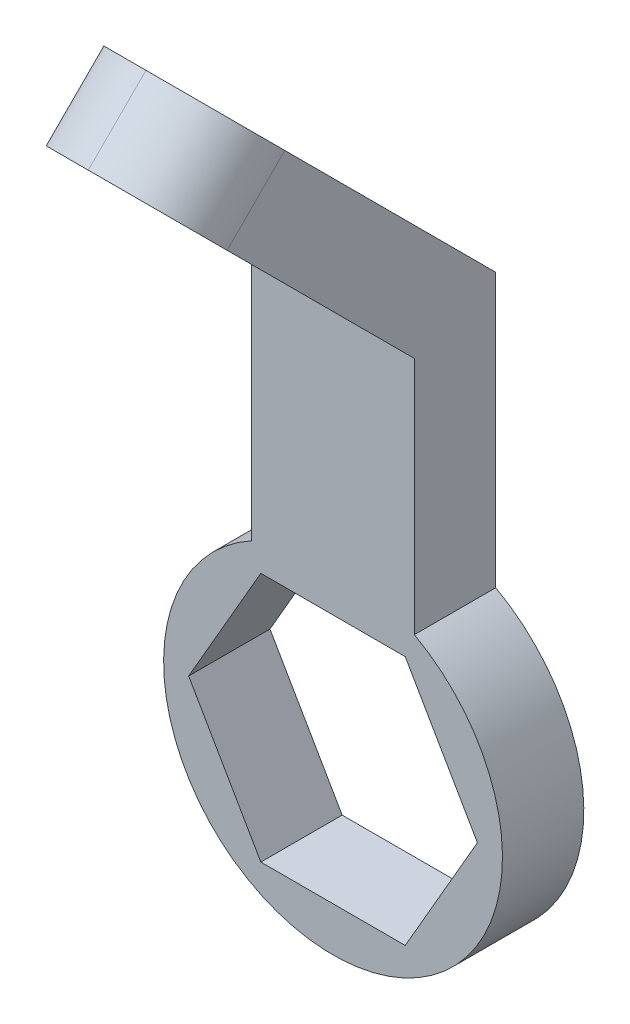
ISO-10303-21;
HEADER;
FILE_DESCRIPTION(('STEP AP214'),'2;1');
FILE_NAME('part.step','',(''),(''),'','','');
FILE_SCHEMA(('AUTOMOTIVE_DESIGN { 1 0 10303 214 1 1 1 1 }'));
ENDSEC;
DATA;
#1=APPLICATION_CONTEXT('core data for automotive mechanical design processes');
#2=APPLICATION_PROTOCOL_DEFINITION('international standard','automotive_design',2000,#1);
#3=PRODUCT_CONTEXT('',#1,'mechanical');
#4=PRODUCT('Part','Part','',(#3));
#5=PRODUCT_RELATED_PRODUCT_CATEGORY('part','',(#4));
#6=PRODUCT_DEFINITION_FORMATION('','',#4);
#7=PRODUCT_DEFINITION_CONTEXT('part definition',#1,'design');
#8=PRODUCT_DEFINITION('design','',#6,#7);
#9=PRODUCT_DEFINITION_SHAPE('','',#8);
#10=(LENGTH_UNIT() NAMED_UNIT(*) SI_UNIT(.MILLI.,.METRE.));
#11=(NAMED_UNIT(*) PLANE_ANGLE_UNIT() SI_UNIT($,.RADIAN.));
#12=(NAMED_UNIT(*) SI_UNIT($,.STERADIAN.) SOLID_ANGLE_UNIT());
#13=UNCERTAINTY_MEASURE_WITH_UNIT(LENGTH_MEASURE(1.E-05),#10,'distance_accuracy_value','');
#14=(GEOMETRIC_REPRESENTATION_CONTEXT(3) GLOBAL_UNCERTAINTY_ASSIGNED_CONTEXT((#13)) GLOBAL_UNIT_ASSIGNED_CONTEXT((#10,
#11,#12)) REPRESENTATION_CONTEXT('',''));
#15=CARTESIAN_POINT('',(0.,0.,0.));
#16=DIRECTION('',(0.,0.,1.));
#17=DIRECTION('',(1.,0.,0.));
#18=AXIS2_PLACEMENT_3D('',#15,#16,#17);
#19=CARTESIAN_POINT('',(0.,0.958861684190168,89.7649069469521));
#20=DIRECTION('',(0.,0.707106781186548,-0.707106781186547));
#21=DIRECTION('',(0.,0.707106781186547,0.707106781186548));
#22=AXIS2_PLACEMENT_3D('',#19,#20,#21);
#23=CYLINDRICAL_SURFACE('',#22,4.);
#24=CARTESIAN_POINT('',(0.,60.1282406104083,30.595528020734));
#25=DIRECTION('',(0.,-0.707106781186548,0.707106781186547));
#26=DIRECTION('',(0.,-0.707106781186547,-0.707106781186548));
#27=AXIS2_PLACEMENT_3D('',#24,#25,#26);
#28=CIRCLE('',#27,4.);
#29=CARTESIAN_POINT('',(0.,57.2998134856621,27.7671008959878));
#30=VERTEX_POINT('',#29);
#31=EDGE_CURVE('E174',#30,#30,#28,.T.);
#32=ORIENTED_EDGE('',*,*,#31,.T.);
#33=EDGE_LOOP('',(#32));
#34=FACE_BOUND('',#33,.T.);
#35=CARTESIAN_POINT('',(0.,64.9958772070163,25.727891424126));
#36=DIRECTION('',(0.,0.707106781186548,-0.707106781186547));
#37=DIRECTION('',(0.,0.707106781186547,0.707106781186548));
#38=AXIS2_PLACEMENT_3D('',#35,#36,#37);
#39=CIRCLE('',#38,4.);
#40=CARTESIAN_POINT('',(0.,67.8243043317625,28.5563185488722));
#41=VERTEX_POINT('',#40);
#42=EDGE_CURVE('E270',#41,#41,#39,.T.);
#43=ORIENTED_EDGE('',*,*,#42,.T.);
#44=EDGE_LOOP('',(#43));
#45=FACE_BOUND('',#44,.T.);
#46=ADVANCED_FACE('F43',(#34,#45),#23,.F.);
#47=CARTESIAN_POINT('',(0.,-21.8968107831433,-6.2));
#48=DIRECTION('',(0.,0.,1.));
#49=DIRECTION('',(1.,0.,0.));
#50=AXIS2_PLACEMENT_3D('',#47,#48,#49);
#51=CYLINDRICAL_SURFACE('',#50,24.9999979598998);
#52=DIRECTION('',(0.,0.,1.));
#53=VECTOR('',#52,1.);
#54=CARTESIAN_POINT('',(12.0000001284265,0.0348990205350161,-6.2));
#55=LINE('',#54,#53);
#56=CARTESIAN_POINT('',(12.0000001284265,0.0348990205350161,-6.2));
#57=VERTEX_POINT('',#56);
#58=CARTESIAN_POINT('',(12.0000001284265,0.0348990205350161,5.8));
#59=VERTEX_POINT('',#58);
#60=EDGE_CURVE('E230',#57,#59,#55,.T.);
#61=ORIENTED_EDGE('',*,*,#60,.T.);
#62=CARTESIAN_POINT('',(0.,-21.8968107831433,5.8));
#63=DIRECTION('',(0.,0.,1.));
#64=DIRECTION('',(1.,0.,0.));
#65=AXIS2_PLACEMENT_3D('',#62,#63,#64);
#66=CIRCLE('',#65,24.9999979598998);
#67=CARTESIAN_POINT('',(-12.0000000801898,0.0348990205350161,5.8));
#68=VERTEX_POINT('',#67);
#69=EDGE_CURVE('E200',#68,#59,#66,.T.);
#70=ORIENTED_EDGE('',*,*,#69,.F.);
#71=DIRECTION('',(0.,0.,1.));
#72=VECTOR('',#71,1.);
#73=CARTESIAN_POINT('',(-12.0000000801898,0.0348990205350161,-6.2));
#74=LINE('',#73,#72);
#75=CARTESIAN_POINT('',(-12.0000000801898,0.0348990205350161,-6.2));
#76=VERTEX_POINT('',#75);
#77=EDGE_CURVE('E227',#76,#68,#74,.T.);
#78=ORIENTED_EDGE('',*,*,#77,.F.);
#79=CARTESIAN_POINT('',(0.,-21.8968107831433,-6.2));
#80=DIRECTION('',(0.,0.,1.));
#81=DIRECTION('',(1.,0.,0.));
#82=AXIS2_PLACEMENT_3D('',#79,#80,#81);
#83=CIRCLE('',#82,24.9999979598998);
#84=EDGE_CURVE('E149',#76,#57,#83,.T.);
#85=ORIENTED_EDGE('',*,*,#84,.T.);
#86=EDGE_LOOP('',(#61,#70,#78,#85));
#87=FACE_BOUND('',#86,.T.);
#88=ADVANCED_FACE('F286',(#87),#51,.T.);
#89=CARTESIAN_POINT('',(-12.0000000801898,0.,-6.2));
#90=DIRECTION('',(1.,0.,0.));
#91=DIRECTION('',(0.,0.,-1.));
#92=AXIS2_PLACEMENT_3D('',#89,#90,#91);
#93=PLANE('',#92);
#94=DIRECTION('',(0.,-0.707106781186547,-0.707106781186548));
#95=VECTOR('',#94,1.);
#96=CARTESIAN_POINT('',(-11.9999998715735,71.441949109393,41.9092365197188));
#97=LINE('',#96,#95);
#98=CARTESIAN_POINT('',(-11.9999998715735,62.9566677351544,33.4239551454802));
#99=VERTEX_POINT('',#98);
#100=CARTESIAN_POINT('',(-11.9999998715735,35.3511856291118,5.81847303943753));
#101=VERTEX_POINT('',#100);
#102=EDGE_CURVE('E166',#99,#101,#97,.T.);
#103=ORIENTED_EDGE('',*,*,#102,.F.);
#104=DIRECTION('',(0.,-0.707106781186548,0.707106781186547));
#105=VECTOR('',#104,1.);
#106=CARTESIAN_POINT('',(-12.0000000801898,71.4659042548732,24.9147186257614));
#107=LINE('',#106,#105);
#108=CARTESIAN_POINT('',(-11.9999998715735,71.4659042548732,24.9147186257614));
#109=VERTEX_POINT('',#108);
#110=EDGE_CURVE('E165',#99,#109,#107,.F.);
#111=ORIENTED_EDGE('',*,*,#110,.T.);
#112=DIRECTION('',(0.,0.707106781186547,0.707106781186548));
#113=VECTOR('',#112,1.);
#114=CARTESIAN_POINT('',(-11.9999998715735,40.3511856291118,-6.2));
#115=LINE('',#114,#113);
#116=CARTESIAN_POINT('',(-11.9999998715735,40.3511856291118,-6.2));
#117=VERTEX_POINT('',#116);
#118=EDGE_CURVE('E156',#117,#109,#115,.T.);
#119=ORIENTED_EDGE('',*,*,#118,.F.);
#120=DIRECTION('',(0.,1.,0.));
#121=VECTOR('',#120,1.);
#122=CARTESIAN_POINT('',(-12.0000000801898,0.,-6.2));
#123=LINE('',#122,#121);
#124=EDGE_CURVE('E143',#76,#117,#123,.T.);
#125=ORIENTED_EDGE('',*,*,#124,.F.);
#126=ORIENTED_EDGE('',*,*,#77,.T.);
#127=DIRECTION('',(0.,1.,0.));
#128=VECTOR('',#127,1.);
#129=CARTESIAN_POINT('',(-12.0000000801898,0.,5.8));
#130=LINE('',#129,#128);
#131=CARTESIAN_POINT('',(-12.0000000801898,35.3511856291118,5.8));
#132=VERTEX_POINT('',#131);
#133=EDGE_CURVE('E209',#68,#132,#130,.T.);
#134=ORIENTED_EDGE('',*,*,#133,.T.);
#135=DIRECTION('',(0.,0.,-1.));
#136=VECTOR('',#135,1.);
#137=CARTESIAN_POINT('',(-11.9999998715735,35.3511856291118,5.81847303943753));
#138=LINE('',#137,#136);
#139=EDGE_CURVE('E159',#101,#132,#138,.T.);
#140=ORIENTED_EDGE('',*,*,#139,.F.);
#141=EDGE_LOOP('',(#103,#111,#119,#125,#126,#134,#140));
#142=FACE_BOUND('',#141,.T.);
#143=ADVANCED_FACE('F163',(#142),#93,.F.);
#144=CARTESIAN_POINT('',(-2.59716233791978E-06,-40.3468107831432,-6.2));
#145=DIRECTION('',(-6.43709450018008E-08,-0.999999999999998,0.));
#146=DIRECTION('',(0.999999999999998,-6.43709450018008E-08,0.));
#147=AXIS2_PLACEMENT_3D('',#144,#145,#146);
#148=PLANE('',#147);
#149=DIRECTION('',(0.,0.,1.));
#150=VECTOR('',#149,1.);
#151=CARTESIAN_POINT('',(-10.6521136541925,-40.3468100974567,-6.2));
#152=LINE('',#151,#150);
#153=CARTESIAN_POINT('',(-10.6521136541925,-40.3468100974567,-6.2));
#154=VERTEX_POINT('',#153);
#155=CARTESIAN_POINT('',(-10.6521136541925,-40.3468100974567,5.8));
#156=VERTEX_POINT('',#155);
#157=EDGE_CURVE('E152',#154,#156,#152,.T.);
#158=ORIENTED_EDGE('',*,*,#157,.T.);
#159=DIRECTION('',(0.999999999999998,-6.43709450018008E-08,0.));
#160=VECTOR('',#159,1.);
#161=CARTESIAN_POINT('',(-2.59716233791978E-06,-40.3468107831432,5.8));
#162=LINE('',#161,#160);
#163=CARTESIAN_POINT('',(10.6521112789046,-40.3468114688298,5.8));
#164=VERTEX_POINT('',#163);
#165=EDGE_CURVE('E181',#156,#164,#162,.T.);
#166=ORIENTED_EDGE('',*,*,#165,.T.);
#167=DIRECTION('',(0.,0.,1.));
#168=VECTOR('',#167,1.);
#169=CARTESIAN_POINT('',(10.6521112789046,-40.3468114688298,-6.2));
#170=LINE('',#169,#168);
#171=CARTESIAN_POINT('',(10.6521112789046,-40.3468114688298,-6.2));
#172=VERTEX_POINT('',#171);
#173=EDGE_CURVE('E232',#172,#164,#170,.T.);
#174=ORIENTED_EDGE('',*,*,#173,.F.);
#175=DIRECTION('',(0.999999999999998,-6.43709450018008E-08,0.));
#176=VECTOR('',#175,1.);
#177=CARTESIAN_POINT('',(-2.59716233791978E-06,-40.3468107831432,-6.2));
#178=LINE('',#177,#176);
#179=EDGE_CURVE('E212',#154,#172,#178,.T.);
#180=ORIENTED_EDGE('',*,*,#179,.F.);
#181=EDGE_LOOP('',(#158,#166,#174,#180));
#182=FACE_BOUND('',#181,.T.);
#183=ADVANCED_FACE('F315',(#182),#148,.F.);
#184=CARTESIAN_POINT('',(25.4597660107916,-14.6992049449944,-6.2));
#185=DIRECTION('',(0.866025371598965,-0.500000055746872,0.));
#186=DIRECTION('',(0.500000055746872,0.866025371598965,0.));
#187=AXIS2_PLACEMENT_3D('',#184,#185,#186);
#188=PLANE('',#187);
#189=ORIENTED_EDGE('',*,*,#173,.T.);
#190=DIRECTION('',(0.500000055746872,0.866025371598965,0.));
#191=VECTOR('',#190,1.);
#192=CARTESIAN_POINT('',(25.4597660107916,-14.6992049449944,5.8));
#193=LINE('',#192,#191);
#194=CARTESIAN_POINT('',(21.3042249330971,-21.8968121545164,5.8));
#195=VERTEX_POINT('',#194);
#196=EDGE_CURVE('E197',#164,#195,#193,.T.);
#197=ORIENTED_EDGE('',*,*,#196,.T.);
#198=DIRECTION('',(0.,0.,1.));
#199=VECTOR('',#198,1.);
#200=CARTESIAN_POINT('',(21.3042249330971,-21.8968121545164,-6.2));
#201=LINE('',#200,#199);
#202=CARTESIAN_POINT('',(21.3042249330971,-21.8968121545164,-6.2));
#203=VERTEX_POINT('',#202);
#204=EDGE_CURVE('E234',#203,#195,#201,.T.);
#205=ORIENTED_EDGE('',*,*,#204,.F.);
#206=DIRECTION('',(0.500000055746872,0.866025371598965,0.));
#207=VECTOR('',#206,1.);
#208=CARTESIAN_POINT('',(25.4597660107916,-14.6992049449944,-6.2));
#209=LINE('',#208,#207);
#210=EDGE_CURVE('E223',#172,#203,#209,.T.);
#211=ORIENTED_EDGE('',*,*,#210,.F.);
#212=EDGE_LOOP('',(#189,#197,#205,#211));
#213=FACE_BOUND('',#212,.T.);
#214=ADVANCED_FACE('F320',(#213),#188,.F.);
#215=CARTESIAN_POINT('',(6.49657279837254,3.75079749636303,-6.2));
#216=DIRECTION('',(0.866025435969909,0.499999944253125,0.));
#217=DIRECTION('',(-0.499999944253125,0.866025435969909,0.));
#218=AXIS2_PLACEMENT_3D('',#215,#216,#217);
#219=PLANE('',#218);
#220=ORIENTED_EDGE('',*,*,#204,.T.);
#221=DIRECTION('',(-0.499999944253125,0.866025435969909,0.));
#222=VECTOR('',#221,1.);
#223=CARTESIAN_POINT('',(6.49657279837254,3.75079749636303,5.8));
#224=LINE('',#223,#222);
#225=CARTESIAN_POINT('',(10.6521136541925,-3.44681146882988,5.8));
#226=VERTEX_POINT('',#225);
#227=EDGE_CURVE('E194',#195,#226,#224,.T.);
#228=ORIENTED_EDGE('',*,*,#227,.T.);
#229=DIRECTION('',(0.,0.,1.));
#230=VECTOR('',#229,1.);
#231=CARTESIAN_POINT('',(10.6521136541925,-3.44681146882988,-6.2));
#232=LINE('',#231,#230);
#233=CARTESIAN_POINT('',(10.6521136541925,-3.44681146882988,-6.2));
#234=VERTEX_POINT('',#233);
#235=EDGE_CURVE('E236',#234,#226,#232,.T.);
#236=ORIENTED_EDGE('',*,*,#235,.F.);
#237=DIRECTION('',(-0.499999944253125,0.866025435969909,0.));
#238=VECTOR('',#237,1.);
#239=CARTESIAN_POINT('',(6.49657279837254,3.75079749636303,-6.2));
#240=LINE('',#239,#238);
#241=EDGE_CURVE('E221',#203,#234,#240,.T.);
#242=ORIENTED_EDGE('',*,*,#241,.F.);
#243=EDGE_LOOP('',(#220,#228,#236,#242));
#244=FACE_BOUND('',#243,.T.);
#245=ADVANCED_FACE('F323',(#244),#219,.F.);
#246=CARTESIAN_POINT('',(-2.21874467212998E-07,-3.44681078314324,-6.2));
#247=DIRECTION('',(6.43709449610877E-08,0.999999999999998,0.));
#248=DIRECTION('',(-0.999999999999998,6.43709449610877E-08,0.));
#249=AXIS2_PLACEMENT_3D('',#246,#247,#248);
#250=PLANE('',#249);
#251=ORIENTED_EDGE('',*,*,#235,.T.);
#252=DIRECTION('',(-0.999999999999998,6.43709449610877E-08,0.));
#253=VECTOR('',#252,1.);
#254=CARTESIAN_POINT('',(-2.21874467212998E-07,-3.44681078314324,5.8));
#255=LINE('',#254,#253);
#256=CARTESIAN_POINT('',(-10.6521112789046,-3.44681009745679,5.8));
#257=VERTEX_POINT('',#256);
#258=EDGE_CURVE('E191',#226,#257,#255,.T.);
#259=ORIENTED_EDGE('',*,*,#258,.T.);
#260=DIRECTION('',(0.,0.,1.));
#261=VECTOR('',#260,1.);
#262=CARTESIAN_POINT('',(-10.6521112789046,-3.44681009745679,-6.2));
#263=LINE('',#262,#261);
#264=CARTESIAN_POINT('',(-10.6521112789046,-3.44681009745679,-6.2));
#265=VERTEX_POINT('',#264);
#266=EDGE_CURVE('E238',#265,#257,#263,.T.);
#267=ORIENTED_EDGE('',*,*,#266,.F.);
#268=DIRECTION('',(-0.999999999999998,6.43709449610877E-08,0.));
#269=VECTOR('',#268,1.);
#270=CARTESIAN_POINT('',(-2.21874467212998E-07,-3.44681078314324,-6.2));
#271=LINE('',#270,#269);
#272=EDGE_CURVE('E219',#234,#265,#271,.T.);
#273=ORIENTED_EDGE('',*,*,#272,.F.);
#274=EDGE_LOOP('',(#251,#259,#267,#273));
#275=FACE_BOUND('',#274,.T.);
#276=ADVANCED_FACE('F327',(#275),#250,.F.);
#277=CARTESIAN_POINT('',(-6.49657020121022,3.75079711206519,-6.2));
#278=DIRECTION('',(-0.866025371598965,0.500000055746872,0.));
#279=DIRECTION('',(-0.500000055746872,-0.866025371598965,0.));
#280=AXIS2_PLACEMENT_3D('',#277,#278,#279);
#281=PLANE('',#280);
#282=ORIENTED_EDGE('',*,*,#266,.T.);
#283=DIRECTION('',(-0.500000055746872,-0.866025371598965,0.));
#284=VECTOR('',#283,1.);
#285=CARTESIAN_POINT('',(-6.49657020121022,3.75079711206519,5.8));
#286=LINE('',#285,#284);
#287=CARTESIAN_POINT('',(-21.3042249330971,-21.8968094117702,5.8));
#288=VERTEX_POINT('',#287);
#289=EDGE_CURVE('E188',#257,#288,#286,.T.);
#290=ORIENTED_EDGE('',*,*,#289,.T.);
#291=DIRECTION('',(0.,0.,1.));
#292=VECTOR('',#291,1.);
#293=CARTESIAN_POINT('',(-21.3042249330971,-21.8968094117702,-6.2));
#294=LINE('',#293,#292);
#295=CARTESIAN_POINT('',(-21.3042249330971,-21.8968094117702,-6.2));
#296=VERTEX_POINT('',#295);
#297=EDGE_CURVE('E240',#296,#288,#294,.T.);
#298=ORIENTED_EDGE('',*,*,#297,.F.);
#299=DIRECTION('',(-0.500000055746872,-0.866025371598965,0.));
#300=VECTOR('',#299,1.);
#301=CARTESIAN_POINT('',(-6.49657020121022,3.75079711206519,-6.2));
#302=LINE('',#301,#300);
#303=EDGE_CURVE('E217',#265,#296,#302,.T.);
#304=ORIENTED_EDGE('',*,*,#303,.F.);
#305=EDGE_LOOP('',(#282,#290,#298,#304));
#306=FACE_BOUND('',#305,.T.);
#307=ADVANCED_FACE('F331',(#306),#281,.F.);
#308=CARTESIAN_POINT('',(-25.4597657889171,-14.6992004465773,-6.2));
#309=DIRECTION('',(-0.866025435969909,-0.499999944253125,0.));
#310=DIRECTION('',(0.499999944253125,-0.86602543596991,0.));
#311=AXIS2_PLACEMENT_3D('',#308,#309,#310);
#312=PLANE('',#311);
#313=ORIENTED_EDGE('',*,*,#297,.T.);
#314=DIRECTION('',(0.499999944253125,-0.866025435969909,0.));
#315=VECTOR('',#314,1.);
#316=CARTESIAN_POINT('',(-25.4597657889171,-14.6992004465773,5.8));
#317=LINE('',#316,#315);
#318=EDGE_CURVE('E185',#288,#156,#317,.T.);
#319=ORIENTED_EDGE('',*,*,#318,.T.);
#320=ORIENTED_EDGE('',*,*,#157,.F.);
#321=DIRECTION('',(0.499999944253125,-0.866025435969909,0.));
#322=VECTOR('',#321,1.);
#323=CARTESIAN_POINT('',(-25.4597657889171,-14.6992004465773,-6.2));
#324=LINE('',#323,#322);
#325=EDGE_CURVE('E215',#296,#154,#324,.T.);
#326=ORIENTED_EDGE('',*,*,#325,.F.);
#327=EDGE_LOOP('',(#313,#319,#320,#326));
#328=FACE_BOUND('',#327,.T.);
#329=ADVANCED_FACE('F317',(#328),#312,.F.);
#330=CARTESIAN_POINT('',(12.0000001284265,0.,-6.2));
#331=DIRECTION('',(1.,0.,0.));
#332=DIRECTION('',(0.,0.,-1.));
#333=AXIS2_PLACEMENT_3D('',#330,#331,#332);
#334=PLANE('',#333);
#335=DIRECTION('',(0.,0.707106781186547,0.707106781186548));
#336=VECTOR('',#335,1.);
#337=CARTESIAN_POINT('',(12.0000001284265,40.3511856291118,-6.2));
#338=LINE('',#337,#336);
#339=CARTESIAN_POINT('',(12.0000001284265,40.3511856291118,-6.2));
#340=VERTEX_POINT('',#339);
#341=CARTESIAN_POINT('',(12.0000001284265,71.4659042548732,24.9147186257614));
#342=VERTEX_POINT('',#341);
#343=EDGE_CURVE('E157',#340,#342,#338,.T.);
#344=ORIENTED_EDGE('',*,*,#343,.T.);
#345=DIRECTION('',(0.,-0.707106781186548,0.707106781186547));
#346=VECTOR('',#345,1.);
#347=CARTESIAN_POINT('',(12.0000001284265,51.2903114403172,45.0903114403174));
#348=LINE('',#347,#346);
#349=CARTESIAN_POINT('',(12.0000001284265,62.9566677351544,33.4239551454802));
#350=VERTEX_POINT('',#349);
#351=EDGE_CURVE('E11',#342,#350,#348,.T.);
#352=ORIENTED_EDGE('',*,*,#351,.T.);
#353=DIRECTION('',(0.,-0.707106781186547,-0.707106781186548));
#354=VECTOR('',#353,1.);
#355=CARTESIAN_POINT('',(12.0000001284265,71.441949109393,41.9092365197188));
#356=LINE('',#355,#354);
#357=CARTESIAN_POINT('',(12.0000001284265,35.3511856291118,5.81847303943753));
#358=VERTEX_POINT('',#357);
#359=EDGE_CURVE('E171',#350,#358,#356,.T.);
#360=ORIENTED_EDGE('',*,*,#359,.T.);
#361=DIRECTION('',(0.,0.,-1.));
#362=VECTOR('',#361,1.);
#363=CARTESIAN_POINT('',(12.0000001284265,35.3511856291118,5.81847303943753));
#364=LINE('',#363,#362);
#365=CARTESIAN_POINT('',(12.0000001284265,35.3511856291118,5.8));
#366=VERTEX_POINT('',#365);
#367=EDGE_CURVE('E167',#358,#366,#364,.T.);
#368=ORIENTED_EDGE('',*,*,#367,.T.);
#369=DIRECTION('',(0.,1.,0.));
#370=VECTOR('',#369,1.);
#371=CARTESIAN_POINT('',(12.0000001284265,0.,5.8));
#372=LINE('',#371,#370);
#373=EDGE_CURVE('E203',#59,#366,#372,.T.);
#374=ORIENTED_EDGE('',*,*,#373,.F.);
#375=ORIENTED_EDGE('',*,*,#60,.F.);
#376=DIRECTION('',(0.,1.,0.));
#377=VECTOR('',#376,1.);
#378=CARTESIAN_POINT('',(12.0000001284265,0.,-6.2));
#379=LINE('',#378,#377);
#380=EDGE_CURVE('E153',#57,#340,#379,.T.);
#381=ORIENTED_EDGE('',*,*,#380,.T.);
#382=EDGE_LOOP('',(#344,#352,#360,#368,#374,#375,#381));
#383=FACE_BOUND('',#382,.T.);
#384=ADVANCED_FACE('F311',(#383),#334,.T.);
#385=CARTESIAN_POINT('',(0.,0.,-6.2));
#386=DIRECTION('',(0.,0.,1.));
#387=DIRECTION('',(1.,0.,0.));
#388=AXIS2_PLACEMENT_3D('',#385,#386,#387);
#389=PLANE('',#388);
#390=ORIENTED_EDGE('',*,*,#179,.T.);
#391=ORIENTED_EDGE('',*,*,#210,.T.);
#392=ORIENTED_EDGE('',*,*,#241,.T.);
#393=ORIENTED_EDGE('',*,*,#272,.T.);
#394=ORIENTED_EDGE('',*,*,#303,.T.);
#395=ORIENTED_EDGE('',*,*,#325,.T.);
#396=EDGE_LOOP('',(#390,#391,#392,#393,#394,#395));
#397=FACE_BOUND('',#396,.T.);
#398=ORIENTED_EDGE('',*,*,#84,.F.);
#399=ORIENTED_EDGE('',*,*,#124,.T.);
#400=DIRECTION('',(1.,0.,0.));
#401=VECTOR('',#400,1.);
#402=CARTESIAN_POINT('',(-11.9999998715735,40.3511856291118,-6.2));
#403=LINE('',#402,#401);
#404=EDGE_CURVE('E147',#117,#340,#403,.T.);
#405=ORIENTED_EDGE('',*,*,#404,.T.);
#406=ORIENTED_EDGE('',*,*,#380,.F.);
#407=EDGE_LOOP('',(#398,#399,#405,#406));
#408=FACE_BOUND('',#407,.T.);
#409=ADVANCED_FACE('F145',(#397,#408),#389,.F.);
#410=CARTESIAN_POINT('',(0.,0.,5.8));
#411=DIRECTION('',(0.,0.,1.));
#412=DIRECTION('',(1.,0.,0.));
#413=AXIS2_PLACEMENT_3D('',#410,#411,#412);
#414=PLANE('',#413);
#415=ORIENTED_EDGE('',*,*,#165,.F.);
#416=ORIENTED_EDGE('',*,*,#318,.F.);
#417=ORIENTED_EDGE('',*,*,#289,.F.);
#418=ORIENTED_EDGE('',*,*,#258,.F.);
#419=ORIENTED_EDGE('',*,*,#227,.F.);
#420=ORIENTED_EDGE('',*,*,#196,.F.);
#421=EDGE_LOOP('',(#415,#416,#417,#418,#419,#420));
#422=FACE_BOUND('',#421,.T.);
#423=ORIENTED_EDGE('',*,*,#69,.T.);
#424=ORIENTED_EDGE('',*,*,#373,.T.);
#425=DIRECTION('',(-1.,0.,0.));
#426=VECTOR('',#425,1.);
#427=CARTESIAN_POINT('',(0.,35.3511856291118,5.8));
#428=LINE('',#427,#426);
#429=EDGE_CURVE('E206',#366,#132,#428,.T.);
#430=ORIENTED_EDGE('',*,*,#429,.T.);
#431=ORIENTED_EDGE('',*,*,#133,.F.);
#432=EDGE_LOOP('',(#423,#424,#430,#431));
#433=FACE_BOUND('',#432,.T.);
#434=ADVANCED_FACE('F299',(#422,#433),#414,.T.);
#435=CARTESIAN_POINT('',(-11.9999998715735,35.3511856291118,5.81847303943753));
#436=DIRECTION('',(0.,-1.,0.));
#437=DIRECTION('',(0.,0.,-1.));
#438=AXIS2_PLACEMENT_3D('',#435,#436,#437);
#439=PLANE('',#438);
#440=ORIENTED_EDGE('',*,*,#429,.F.);
#441=ORIENTED_EDGE('',*,*,#367,.F.);
#442=DIRECTION('',(1.,0.,0.));
#443=VECTOR('',#442,1.);
#444=CARTESIAN_POINT('',(-11.9999998715735,35.3511856291118,5.81847303943753));
#445=LINE('',#444,#443);
#446=EDGE_CURVE('E158',#101,#358,#445,.T.);
#447=ORIENTED_EDGE('',*,*,#446,.F.);
#448=ORIENTED_EDGE('',*,*,#139,.T.);
#449=EDGE_LOOP('',(#440,#441,#447,#448));
#450=FACE_BOUND('',#449,.T.);
#451=ADVANCED_FACE('F296',(#450),#439,.T.);
#452=CARTESIAN_POINT('',(-11.9999998715735,71.441949109393,41.9092365197188));
#453=DIRECTION('',(0.,-0.707106781186548,0.707106781186547));
#454=DIRECTION('',(0.,-0.707106781186547,-0.707106781186548));
#455=AXIS2_PLACEMENT_3D('',#452,#453,#454);
#456=PLANE('',#455);
#457=ORIENTED_EDGE('',*,*,#31,.F.);
#458=EDGE_LOOP('',(#457));
#459=FACE_BOUND('',#458,.T.);
#460=CARTESIAN_POINT('',(1.2842648298983E-07,62.9566677351544,33.4239551454802));
#461=DIRECTION('',(0.,-0.707106781186548,0.707106781186547));
#462=DIRECTION('',(0.,-0.707106781186547,-0.707106781186548));
#463=AXIS2_PLACEMENT_3D('',#460,#461,#462);
#464=CIRCLE('',#463,12.);
#465=CARTESIAN_POINT('',(1.2842648298983E-07,71.441949109393,41.9092365197188));
#466=VERTEX_POINT('',#465);
#467=EDGE_CURVE('E229',#350,#466,#464,.T.);
#468=ORIENTED_EDGE('',*,*,#467,.T.);
#469=CARTESIAN_POINT('',(-8.01897766938842E-08,62.9566677351544,33.4239551454802));
#470=DIRECTION('',(0.,-0.707106781186548,0.707106781186547));
#471=DIRECTION('',(0.,-0.707106781186547,-0.707106781186548));
#472=AXIS2_PLACEMENT_3D('',#469,#470,#471);
#473=CIRCLE('',#472,12.);
#474=EDGE_CURVE('E244',#466,#99,#473,.T.);
#475=ORIENTED_EDGE('',*,*,#474,.T.);
#476=ORIENTED_EDGE('',*,*,#102,.T.);
#477=ORIENTED_EDGE('',*,*,#446,.T.);
#478=ORIENTED_EDGE('',*,*,#359,.F.);
#479=EDGE_LOOP('',(#468,#475,#476,#477,#478));
#480=FACE_BOUND('',#479,.T.);
#481=ADVANCED_FACE('F250',(#459,#480),#456,.T.);
#482=CARTESIAN_POINT('',(-11.9999998715735,40.3511856291118,-6.2));
#483=DIRECTION('',(0.,0.707106781186548,-0.707106781186547));
#484=DIRECTION('',(0.,0.707106781186547,0.707106781186548));
#485=AXIS2_PLACEMENT_3D('',#482,#483,#484);
#486=PLANE('',#485);
#487=CARTESIAN_POINT('',(0.,68.637477130127,22.0862915010152));
#488=DIRECTION('',(0.,0.707106781186548,-0.707106781186547));
#489=DIRECTION('',(0.,0.707106781186547,0.707106781186548));
#490=AXIS2_PLACEMENT_3D('',#487,#488,#489);
#491=CIRCLE('',#490,8.);
#492=CARTESIAN_POINT('',(0.,74.2943313796194,27.7431457505076));
#493=VERTEX_POINT('',#492);
#494=EDGE_CURVE('E265',#493,#493,#491,.T.);
#495=ORIENTED_EDGE('',*,*,#494,.F.);
#496=EDGE_LOOP('',(#495));
#497=FACE_BOUND('',#496,.T.);
#498=ORIENTED_EDGE('',*,*,#118,.T.);
#499=CARTESIAN_POINT('',(-8.01897766938842E-08,71.4659042548732,24.9147186257614));
#500=DIRECTION('',(0.,0.707106781186548,-0.707106781186547));
#501=DIRECTION('',(0.,0.707106781186547,0.707106781186548));
#502=AXIS2_PLACEMENT_3D('',#499,#500,#501);
#503=CIRCLE('',#502,12.);
#504=CARTESIAN_POINT('',(1.2842648298983E-07,79.9511856291118,33.4));
#505=VERTEX_POINT('',#504);
#506=EDGE_CURVE('E52',#109,#505,#503,.T.);
#507=ORIENTED_EDGE('',*,*,#506,.T.);
#508=CARTESIAN_POINT('',(1.2842648298983E-07,71.4659042548732,24.9147186257614));
#509=DIRECTION('',(0.,0.707106781186548,-0.707106781186547));
#510=DIRECTION('',(0.,0.707106781186547,0.707106781186548));
#511=AXIS2_PLACEMENT_3D('',#508,#509,#510);
#512=CIRCLE('',#511,12.);
#513=EDGE_CURVE('E62',#505,#342,#512,.T.);
#514=ORIENTED_EDGE('',*,*,#513,.T.);
#515=ORIENTED_EDGE('',*,*,#343,.F.);
#516=ORIENTED_EDGE('',*,*,#404,.F.);
#517=EDGE_LOOP('',(#498,#507,#514,#515,#516));
#518=FACE_BOUND('',#517,.T.);
#519=ADVANCED_FACE('F155',(#497,#518),#486,.T.);
#520=CARTESIAN_POINT('',(1.2842648298983E-07,51.2903114403172,45.0903114403174));
#521=DIRECTION('',(0.,-0.707106781186548,0.707106781186547));
#522=DIRECTION('',(0.,-0.707106781186547,-0.707106781186548));
#523=AXIS2_PLACEMENT_3D('',#520,#521,#522);
#524=CYLINDRICAL_SURFACE('',#523,12.);
#525=ORIENTED_EDGE('',*,*,#351,.F.);
#526=ORIENTED_EDGE('',*,*,#513,.F.);
#527=DIRECTION('',(0.,-0.707106781186548,0.707106781186547));
#528=VECTOR('',#527,1.);
#529=CARTESIAN_POINT('',(1.2842648298983E-07,79.9511856291118,33.4));
#530=LINE('',#529,#528);
#531=EDGE_CURVE('E47',#466,#505,#530,.F.);
#532=ORIENTED_EDGE('',*,*,#531,.F.);
#533=ORIENTED_EDGE('',*,*,#467,.F.);
#534=EDGE_LOOP('',(#525,#526,#532,#533));
#535=FACE_BOUND('',#534,.T.);
#536=ADVANCED_FACE('F45',(#535),#524,.T.);
#537=CARTESIAN_POINT('',(-8.01897766938842E-08,71.4659042548732,24.9147186257614));
#538=DIRECTION('',(0.,0.707106781186548,-0.707106781186547));
#539=DIRECTION('',(0.,0.707106781186547,0.707106781186548));
#540=AXIS2_PLACEMENT_3D('',#537,#538,#539);
#541=CYLINDRICAL_SURFACE('',#540,12.);
#542=ORIENTED_EDGE('',*,*,#506,.F.);
#543=ORIENTED_EDGE('',*,*,#110,.F.);
#544=ORIENTED_EDGE('',*,*,#474,.F.);
#545=ORIENTED_EDGE('',*,*,#531,.T.);
#546=EDGE_LOOP('',(#542,#543,#544,#545));
#547=FACE_BOUND('',#546,.T.);
#548=ADVANCED_FACE('F258',(#547),#541,.T.);
#549=CARTESIAN_POINT('',(0.,64.9958772070163,25.727891424126));
#550=DIRECTION('',(0.,0.707106781186548,-0.707106781186547));
#551=DIRECTION('',(0.,0.707106781186547,0.707106781186548));
#552=AXIS2_PLACEMENT_3D('',#549,#550,#551);
#553=CYLINDRICAL_SURFACE('',#552,8.);
#554=CARTESIAN_POINT('',(0.,64.9958772070163,25.727891424126));
#555=DIRECTION('',(0.,0.707106781186548,-0.707106781186547));
#556=DIRECTION('',(0.,0.707106781186547,0.707106781186548));
#557=AXIS2_PLACEMENT_3D('',#554,#555,#556);
#558=CIRCLE('',#557,8.);
#559=CARTESIAN_POINT('',(0.,70.6527314565087,31.3847456736183));
#560=VERTEX_POINT('',#559);
#561=EDGE_CURVE('E261',#560,#560,#558,.T.);
#562=ORIENTED_EDGE('',*,*,#561,.F.);
#563=EDGE_LOOP('',(#562));
#564=FACE_BOUND('',#563,.T.);
#565=ORIENTED_EDGE('',*,*,#494,.T.);
#566=EDGE_LOOP('',(#565));
#567=FACE_BOUND('',#566,.T.);
#568=ADVANCED_FACE('F278',(#564,#567),#553,.F.);
#569=CARTESIAN_POINT('',(0.,64.9958772070163,25.727891424126));
#570=DIRECTION('',(0.,0.707106781186548,-0.707106781186547));
#571=DIRECTION('',(0.,0.707106781186547,0.707106781186548));
#572=AXIS2_PLACEMENT_3D('',#569,#570,#571);
#573=PLANE('',#572);
#574=ORIENTED_EDGE('',*,*,#42,.F.);
#575=EDGE_LOOP('',(#574));
#576=FACE_BOUND('',#575,.T.);
#577=ORIENTED_EDGE('',*,*,#561,.T.);
#578=EDGE_LOOP('',(#577));
#579=FACE_BOUND('',#578,.T.);
#580=ADVANCED_FACE('F276',(#576,#579),#573,.T.);
#581=CLOSED_SHELL('',(#46,#88,#143,#183,#214,#245,#276,#307,#329,#384,#409,#434,#451,#481,#519,
#536,#548,#568,#580));
#582=MANIFOLD_SOLID_BREP('B2',#581);
#583=ADVANCED_BREP_SHAPE_REPRESENTATION('',(#18,#582),#14);
#584=SHAPE_DEFINITION_REPRESENTATION(#9,#583);
ENDSEC;
END-ISO-10303-21;
